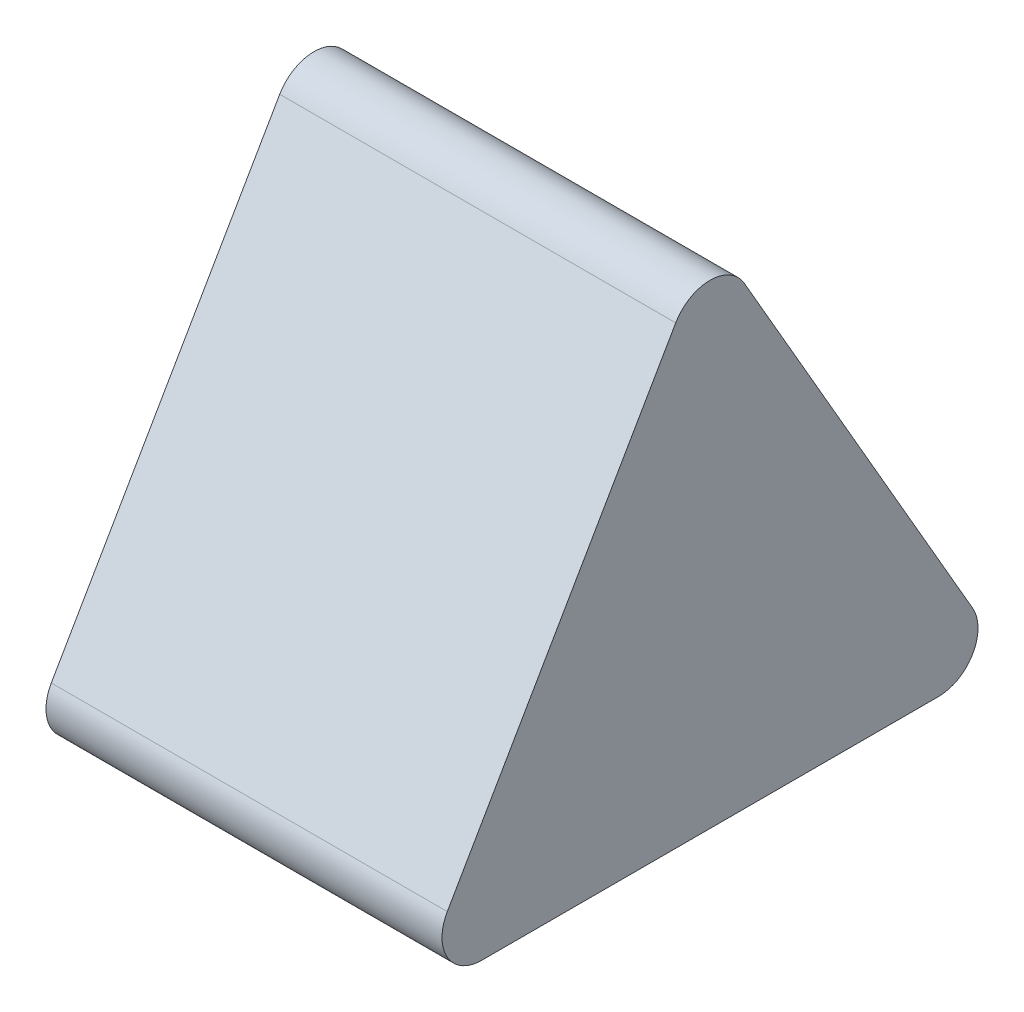
ISO-10303-21;
HEADER;
FILE_DESCRIPTION(('STEP AP214'),'2;1');
FILE_NAME('part.step','',(''),(''),'','','');
FILE_SCHEMA(('AUTOMOTIVE_DESIGN { 1 0 10303 214 1 1 1 1 }'));
ENDSEC;
DATA;
#1=APPLICATION_CONTEXT('core data for automotive mechanical design processes');
#2=APPLICATION_PROTOCOL_DEFINITION('international standard','automotive_design',2000,#1);
#3=PRODUCT_CONTEXT('',#1,'mechanical');
#4=PRODUCT('Part','Part','',(#3));
#5=PRODUCT_RELATED_PRODUCT_CATEGORY('part','',(#4));
#6=PRODUCT_DEFINITION_FORMATION('','',#4);
#7=PRODUCT_DEFINITION_CONTEXT('part definition',#1,'design');
#8=PRODUCT_DEFINITION('design','',#6,#7);
#9=PRODUCT_DEFINITION_SHAPE('','',#8);
#10=(LENGTH_UNIT() NAMED_UNIT(*) SI_UNIT(.MILLI.,.METRE.));
#11=(NAMED_UNIT(*) PLANE_ANGLE_UNIT() SI_UNIT($,.RADIAN.));
#12=(NAMED_UNIT(*) SI_UNIT($,.STERADIAN.) SOLID_ANGLE_UNIT());
#13=UNCERTAINTY_MEASURE_WITH_UNIT(LENGTH_MEASURE(1.E-05),#10,'distance_accuracy_value','');
#14=(GEOMETRIC_REPRESENTATION_CONTEXT(3) GLOBAL_UNCERTAINTY_ASSIGNED_CONTEXT((#13)) GLOBAL_UNIT_ASSIGNED_CONTEXT((#10,
#11,#12)) REPRESENTATION_CONTEXT('',''));
#15=CARTESIAN_POINT('',(0.,0.,0.));
#16=DIRECTION('',(0.,0.,1.));
#17=DIRECTION('',(1.,0.,0.));
#18=AXIS2_PLACEMENT_3D('',#15,#16,#17);
#19=CARTESIAN_POINT('',(20.,6.49519052838329,-11.25));
#20=DIRECTION('',(0.,-0.5,0.866025403784439));
#21=DIRECTION('',(0.,-0.866025403784439,-0.5));
#22=AXIS2_PLACEMENT_3D('',#19,#20,#21);
#23=PLANE('',#22);
#24=DIRECTION('',(0.,0.866025403784439,0.5));
#25=VECTOR('',#24,1.);
#26=CARTESIAN_POINT('',(0.,6.49519052838329,-11.25));
#27=LINE('',#26,#25);
#28=CARTESIAN_POINT('',(0.,3.,-13.2679491924311));
#29=VERTEX_POINT('',#28);
#30=CARTESIAN_POINT('',(0.,22.9807621135332,-1.73205080756887));
#31=VERTEX_POINT('',#30);
#32=EDGE_CURVE('E115',#29,#31,#27,.T.);
#33=ORIENTED_EDGE('',*,*,#32,.T.);
#34=DIRECTION('',(-1.,0.,0.));
#35=VECTOR('',#34,1.);
#36=CARTESIAN_POINT('',(20.,22.9807621135332,-1.73205080756888));
#37=LINE('',#36,#35);
#38=CARTESIAN_POINT('',(20.,22.9807621135332,-1.73205080756887));
#39=VERTEX_POINT('',#38);
#40=EDGE_CURVE('E130',#31,#39,#37,.F.);
#41=ORIENTED_EDGE('',*,*,#40,.T.);
#42=DIRECTION('',(0.,0.866025403784439,0.5));
#43=VECTOR('',#42,1.);
#44=CARTESIAN_POINT('',(20.,6.49519052838329,-11.25));
#45=LINE('',#44,#43);
#46=CARTESIAN_POINT('',(20.,3.,-13.2679491924311));
#47=VERTEX_POINT('',#46);
#48=EDGE_CURVE('E148',#47,#39,#45,.T.);
#49=ORIENTED_EDGE('',*,*,#48,.F.);
#50=DIRECTION('',(-1.,0.,0.));
#51=VECTOR('',#50,1.);
#52=CARTESIAN_POINT('',(20.,3.,-13.2679491924311));
#53=LINE('',#52,#51);
#54=EDGE_CURVE('E127',#47,#29,#53,.T.);
#55=ORIENTED_EDGE('',*,*,#54,.T.);
#56=EDGE_LOOP('',(#33,#41,#49,#55));
#57=FACE_BOUND('',#56,.T.);
#58=ADVANCED_FACE('F44',(#57),#23,.F.);
#59=CARTESIAN_POINT('',(20.,6.49519052838329,11.25));
#60=DIRECTION('',(0.,0.5,0.866025403784439));
#61=DIRECTION('',(0.,-0.866025403784439,0.5));
#62=AXIS2_PLACEMENT_3D('',#59,#60,#61);
#63=PLANE('',#62);
#64=DIRECTION('',(0.,0.866025403784439,-0.5));
#65=VECTOR('',#64,1.);
#66=CARTESIAN_POINT('',(20.,6.49519052838329,11.25));
#67=LINE('',#66,#65);
#68=CARTESIAN_POINT('',(20.,3.,13.2679491924311));
#69=VERTEX_POINT('',#68);
#70=CARTESIAN_POINT('',(20.,22.9807621135332,1.73205080756887));
#71=VERTEX_POINT('',#70);
#72=EDGE_CURVE('E120',#69,#71,#67,.T.);
#73=ORIENTED_EDGE('',*,*,#72,.T.);
#74=DIRECTION('',(-1.,0.,0.));
#75=VECTOR('',#74,1.);
#76=CARTESIAN_POINT('',(0.,22.9807621135332,1.73205080756888));
#77=LINE('',#76,#75);
#78=CARTESIAN_POINT('',(0.,22.9807621135332,1.73205080756887));
#79=VERTEX_POINT('',#78);
#80=EDGE_CURVE('E107',#71,#79,#77,.T.);
#81=ORIENTED_EDGE('',*,*,#80,.T.);
#82=DIRECTION('',(0.,0.866025403784439,-0.5));
#83=VECTOR('',#82,1.);
#84=CARTESIAN_POINT('',(0.,6.49519052838329,11.25));
#85=LINE('',#84,#83);
#86=CARTESIAN_POINT('',(0.,3.,13.2679491924311));
#87=VERTEX_POINT('',#86);
#88=EDGE_CURVE('E100',#87,#79,#85,.T.);
#89=ORIENTED_EDGE('',*,*,#88,.F.);
#90=DIRECTION('',(-1.,0.,0.));
#91=VECTOR('',#90,1.);
#92=CARTESIAN_POINT('',(20.,3.,13.2679491924311));
#93=LINE('',#92,#91);
#94=EDGE_CURVE('E113',#87,#69,#93,.F.);
#95=ORIENTED_EDGE('',*,*,#94,.T.);
#96=EDGE_LOOP('',(#73,#81,#89,#95));
#97=FACE_BOUND('',#96,.T.);
#98=ADVANCED_FACE('F112',(#97),#63,.T.);
#99=CARTESIAN_POINT('',(20.,0.,0.));
#100=DIRECTION('',(0.,1.,0.));
#101=DIRECTION('',(0.,0.,1.));
#102=AXIS2_PLACEMENT_3D('',#99,#100,#101);
#103=PLANE('',#102);
#104=DIRECTION('',(0.,0.,-1.));
#105=VECTOR('',#104,1.);
#106=CARTESIAN_POINT('',(0.,0.,0.));
#107=LINE('',#106,#105);
#108=CARTESIAN_POINT('',(0.,0.,11.5358983848622));
#109=VERTEX_POINT('',#108);
#110=CARTESIAN_POINT('',(0.,0.,-11.5358983848622));
#111=VERTEX_POINT('',#110);
#112=EDGE_CURVE('E101',#109,#111,#107,.T.);
#113=ORIENTED_EDGE('',*,*,#112,.T.);
#114=DIRECTION('',(-1.,0.,0.));
#115=VECTOR('',#114,1.);
#116=CARTESIAN_POINT('',(20.,0.,-11.5358983848622));
#117=LINE('',#116,#115);
#118=CARTESIAN_POINT('',(20.,0.,-11.5358983848622));
#119=VERTEX_POINT('',#118);
#120=EDGE_CURVE('E11',#111,#119,#117,.F.);
#121=ORIENTED_EDGE('',*,*,#120,.T.);
#122=DIRECTION('',(0.,0.,-1.));
#123=VECTOR('',#122,1.);
#124=CARTESIAN_POINT('',(20.,0.,0.));
#125=LINE('',#124,#123);
#126=CARTESIAN_POINT('',(20.,0.,11.5358983848622));
#127=VERTEX_POINT('',#126);
#128=EDGE_CURVE('E117',#127,#119,#125,.T.);
#129=ORIENTED_EDGE('',*,*,#128,.F.);
#130=DIRECTION('',(-1.,0.,0.));
#131=VECTOR('',#130,1.);
#132=CARTESIAN_POINT('',(0.,0.,11.5358983848622));
#133=LINE('',#132,#131);
#134=EDGE_CURVE('E52',#127,#109,#133,.T.);
#135=ORIENTED_EDGE('',*,*,#134,.T.);
#136=EDGE_LOOP('',(#113,#121,#129,#135));
#137=FACE_BOUND('',#136,.T.);
#138=ADVANCED_FACE('F136',(#137),#103,.F.);
#139=CARTESIAN_POINT('',(20.,0.,0.));
#140=DIRECTION('',(1.,0.,0.));
#141=DIRECTION('',(0.,0.,-1.));
#142=AXIS2_PLACEMENT_3D('',#139,#140,#141);
#143=PLANE('',#142);
#144=ORIENTED_EDGE('',*,*,#48,.T.);
#145=CARTESIAN_POINT('',(20.,21.9807621135332,0.));
#146=DIRECTION('',(1.,0.,0.));
#147=DIRECTION('',(0.,0.,-1.));
#148=AXIS2_PLACEMENT_3D('',#145,#146,#147);
#149=CIRCLE('',#148,2.);
#150=EDGE_CURVE('E135',#39,#71,#149,.T.);
#151=ORIENTED_EDGE('',*,*,#150,.T.);
#152=ORIENTED_EDGE('',*,*,#72,.F.);
#153=CARTESIAN_POINT('',(20.,2.,11.5358983848622));
#154=DIRECTION('',(1.,0.,0.));
#155=DIRECTION('',(0.,0.,-1.));
#156=AXIS2_PLACEMENT_3D('',#153,#154,#155);
#157=CIRCLE('',#156,2.);
#158=EDGE_CURVE('E64',#69,#127,#157,.T.);
#159=ORIENTED_EDGE('',*,*,#158,.T.);
#160=ORIENTED_EDGE('',*,*,#128,.T.);
#161=CARTESIAN_POINT('',(20.,2.,-11.5358983848622));
#162=DIRECTION('',(1.,0.,0.));
#163=DIRECTION('',(0.,0.,-1.));
#164=AXIS2_PLACEMENT_3D('',#161,#162,#163);
#165=CIRCLE('',#164,2.);
#166=EDGE_CURVE('E133',#119,#47,#165,.T.);
#167=ORIENTED_EDGE('',*,*,#166,.T.);
#168=EDGE_LOOP('',(#144,#151,#152,#159,#160,#167));
#169=FACE_BOUND('',#168,.T.);
#170=ADVANCED_FACE('F139',(#169),#143,.T.);
#171=CARTESIAN_POINT('',(0.,0.,0.));
#172=DIRECTION('',(1.,0.,0.));
#173=DIRECTION('',(0.,0.,-1.));
#174=AXIS2_PLACEMENT_3D('',#171,#172,#173);
#175=PLANE('',#174);
#176=ORIENTED_EDGE('',*,*,#88,.T.);
#177=CARTESIAN_POINT('',(0.,21.9807621135332,0.));
#178=DIRECTION('',(1.,0.,0.));
#179=DIRECTION('',(0.,0.,-1.));
#180=AXIS2_PLACEMENT_3D('',#177,#178,#179);
#181=CIRCLE('',#180,2.);
#182=EDGE_CURVE('E125',#79,#31,#181,.F.);
#183=ORIENTED_EDGE('',*,*,#182,.T.);
#184=ORIENTED_EDGE('',*,*,#32,.F.);
#185=CARTESIAN_POINT('',(0.,2.,-11.5358983848622));
#186=DIRECTION('',(1.,0.,0.));
#187=DIRECTION('',(0.,0.,-1.));
#188=AXIS2_PLACEMENT_3D('',#185,#186,#187);
#189=CIRCLE('',#188,2.);
#190=EDGE_CURVE('E106',#29,#111,#189,.F.);
#191=ORIENTED_EDGE('',*,*,#190,.T.);
#192=ORIENTED_EDGE('',*,*,#112,.F.);
#193=CARTESIAN_POINT('',(0.,2.,11.5358983848622));
#194=DIRECTION('',(1.,0.,0.));
#195=DIRECTION('',(0.,0.,-1.));
#196=AXIS2_PLACEMENT_3D('',#193,#194,#195);
#197=CIRCLE('',#196,2.);
#198=EDGE_CURVE('E97',#109,#87,#197,.F.);
#199=ORIENTED_EDGE('',*,*,#198,.T.);
#200=EDGE_LOOP('',(#176,#183,#184,#191,#192,#199));
#201=FACE_BOUND('',#200,.T.);
#202=ADVANCED_FACE('F99',(#201),#175,.F.);
#203=CARTESIAN_POINT('',(20.,21.9807621135332,0.));
#204=DIRECTION('',(1.,0.,0.));
#205=DIRECTION('',(0.,0.,-1.));
#206=AXIS2_PLACEMENT_3D('',#203,#204,#205);
#207=CYLINDRICAL_SURFACE('',#206,2.);
#208=ORIENTED_EDGE('',*,*,#150,.F.);
#209=ORIENTED_EDGE('',*,*,#40,.F.);
#210=ORIENTED_EDGE('',*,*,#182,.F.);
#211=ORIENTED_EDGE('',*,*,#80,.F.);
#212=EDGE_LOOP('',(#208,#209,#210,#211));
#213=FACE_BOUND('',#212,.T.);
#214=ADVANCED_FACE('F154',(#213),#207,.T.);
#215=CARTESIAN_POINT('',(20.,2.,-11.5358983848622));
#216=DIRECTION('',(-1.,0.,0.));
#217=DIRECTION('',(0.,0.,1.));
#218=AXIS2_PLACEMENT_3D('',#215,#216,#217);
#219=CYLINDRICAL_SURFACE('',#218,2.);
#220=ORIENTED_EDGE('',*,*,#166,.F.);
#221=ORIENTED_EDGE('',*,*,#120,.F.);
#222=ORIENTED_EDGE('',*,*,#190,.F.);
#223=ORIENTED_EDGE('',*,*,#54,.F.);
#224=EDGE_LOOP('',(#220,#221,#222,#223));
#225=FACE_BOUND('',#224,.T.);
#226=ADVANCED_FACE('F143',(#225),#219,.T.);
#227=CARTESIAN_POINT('',(20.,2.,11.5358983848622));
#228=DIRECTION('',(1.,0.,0.));
#229=DIRECTION('',(0.,0.,-1.));
#230=AXIS2_PLACEMENT_3D('',#227,#228,#229);
#231=CYLINDRICAL_SURFACE('',#230,2.);
#232=ORIENTED_EDGE('',*,*,#158,.F.);
#233=ORIENTED_EDGE('',*,*,#94,.F.);
#234=ORIENTED_EDGE('',*,*,#198,.F.);
#235=ORIENTED_EDGE('',*,*,#134,.F.);
#236=EDGE_LOOP('',(#232,#233,#234,#235));
#237=FACE_BOUND('',#236,.T.);
#238=ADVANCED_FACE('F46',(#237),#231,.T.);
#239=CLOSED_SHELL('',(#58,#98,#138,#170,#202,#214,#226,#238));
#240=MANIFOLD_SOLID_BREP('B2',#239);
#241=ADVANCED_BREP_SHAPE_REPRESENTATION('',(#18,#240),#14);
#242=SHAPE_DEFINITION_REPRESENTATION(#9,#241);
ENDSEC;
END-ISO-10303-21;
